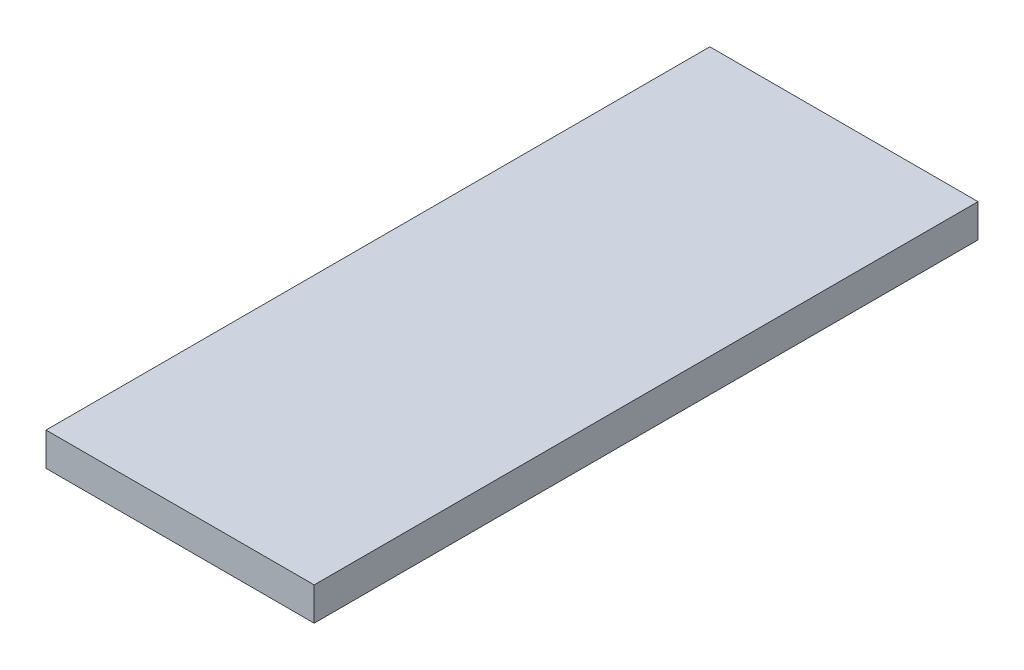
ISO-10303-21;
HEADER;
FILE_DESCRIPTION(('STEP AP214'),'2;1');
FILE_NAME('part.step','',(''),(''),'','','');
FILE_SCHEMA(('AUTOMOTIVE_DESIGN { 1 0 10303 214 1 1 1 1 }'));
ENDSEC;
DATA;
#1=APPLICATION_CONTEXT('core data for automotive mechanical design processes');
#2=APPLICATION_PROTOCOL_DEFINITION('international standard','automotive_design',2000,#1);
#3=PRODUCT_CONTEXT('',#1,'mechanical');
#4=PRODUCT('Part','Part','',(#3));
#5=PRODUCT_RELATED_PRODUCT_CATEGORY('part','',(#4));
#6=PRODUCT_DEFINITION_FORMATION('','',#4);
#7=PRODUCT_DEFINITION_CONTEXT('part definition',#1,'design');
#8=PRODUCT_DEFINITION('design','',#6,#7);
#9=PRODUCT_DEFINITION_SHAPE('','',#8);
#10=(LENGTH_UNIT() NAMED_UNIT(*) SI_UNIT(.MILLI.,.METRE.));
#11=(NAMED_UNIT(*) PLANE_ANGLE_UNIT() SI_UNIT($,.RADIAN.));
#12=(NAMED_UNIT(*) SI_UNIT($,.STERADIAN.) SOLID_ANGLE_UNIT());
#13=UNCERTAINTY_MEASURE_WITH_UNIT(LENGTH_MEASURE(1.E-05),#10,'distance_accuracy_value','');
#14=(GEOMETRIC_REPRESENTATION_CONTEXT(3) GLOBAL_UNCERTAINTY_ASSIGNED_CONTEXT((#13)) GLOBAL_UNIT_ASSIGNED_CONTEXT((#10,
#11,#12)) REPRESENTATION_CONTEXT('',''));
#15=CARTESIAN_POINT('',(0.,0.,0.));
#16=DIRECTION('',(0.,0.,1.));
#17=DIRECTION('',(1.,0.,0.));
#18=AXIS2_PLACEMENT_3D('',#15,#16,#17);
#19=CARTESIAN_POINT('',(6.4135,1.5875,15.875));
#20=DIRECTION('',(-1.,0.,0.));
#21=DIRECTION('',(0.,0.,1.));
#22=AXIS2_PLACEMENT_3D('',#19,#20,#21);
#23=PLANE('',#22);
#24=DIRECTION('',(0.,0.,-1.));
#25=VECTOR('',#24,1.);
#26=CARTESIAN_POINT('',(6.4135,0.,15.875));
#27=LINE('',#26,#25);
#28=CARTESIAN_POINT('',(6.4135,0.,15.875));
#29=VERTEX_POINT('',#28);
#30=CARTESIAN_POINT('',(6.4135,0.,-15.875));
#31=VERTEX_POINT('',#30);
#32=EDGE_CURVE('E99',#29,#31,#27,.T.);
#33=ORIENTED_EDGE('',*,*,#32,.T.);
#34=DIRECTION('',(0.,-1.,0.));
#35=VECTOR('',#34,1.);
#36=CARTESIAN_POINT('',(6.4135,1.5875,-15.875));
#37=LINE('',#36,#35);
#38=CARTESIAN_POINT('',(6.4135,1.5875,-15.875));
#39=VERTEX_POINT('',#38);
#40=EDGE_CURVE('E11',#39,#31,#37,.T.);
#41=ORIENTED_EDGE('',*,*,#40,.F.);
#42=DIRECTION('',(0.,0.,-1.));
#43=VECTOR('',#42,1.);
#44=CARTESIAN_POINT('',(6.4135,1.5875,15.875));
#45=LINE('',#44,#43);
#46=CARTESIAN_POINT('',(6.4135,1.5875,15.875));
#47=VERTEX_POINT('',#46);
#48=EDGE_CURVE('E87',#47,#39,#45,.T.);
#49=ORIENTED_EDGE('',*,*,#48,.F.);
#50=DIRECTION('',(0.,-1.,0.));
#51=VECTOR('',#50,1.);
#52=CARTESIAN_POINT('',(6.4135,1.5875,15.875));
#53=LINE('',#52,#51);
#54=EDGE_CURVE('E95',#47,#29,#53,.T.);
#55=ORIENTED_EDGE('',*,*,#54,.T.);
#56=EDGE_LOOP('',(#33,#41,#49,#55));
#57=FACE_BOUND('',#56,.T.);
#58=ADVANCED_FACE('F36',(#57),#23,.F.);
#59=CARTESIAN_POINT('',(-6.4135,1.5875,-15.875));
#60=DIRECTION('',(0.,0.,1.));
#61=DIRECTION('',(1.,0.,0.));
#62=AXIS2_PLACEMENT_3D('',#59,#60,#61);
#63=PLANE('',#62);
#64=DIRECTION('',(-1.,0.,0.));
#65=VECTOR('',#64,1.);
#66=CARTESIAN_POINT('',(-6.4135,0.,-15.875));
#67=LINE('',#66,#65);
#68=CARTESIAN_POINT('',(-6.4135,0.,-15.875));
#69=VERTEX_POINT('',#68);
#70=EDGE_CURVE('E91',#31,#69,#67,.T.);
#71=ORIENTED_EDGE('',*,*,#70,.T.);
#72=DIRECTION('',(0.,-1.,0.));
#73=VECTOR('',#72,1.);
#74=CARTESIAN_POINT('',(-6.4135,1.5875,-15.875));
#75=LINE('',#74,#73);
#76=CARTESIAN_POINT('',(-6.4135,1.5875,-15.875));
#77=VERTEX_POINT('',#76);
#78=EDGE_CURVE('E44',#77,#69,#75,.T.);
#79=ORIENTED_EDGE('',*,*,#78,.F.);
#80=DIRECTION('',(-1.,0.,0.));
#81=VECTOR('',#80,1.);
#82=CARTESIAN_POINT('',(-6.4135,1.5875,-15.875));
#83=LINE('',#82,#81);
#84=EDGE_CURVE('E82',#39,#77,#83,.T.);
#85=ORIENTED_EDGE('',*,*,#84,.F.);
#86=ORIENTED_EDGE('',*,*,#40,.T.);
#87=EDGE_LOOP('',(#71,#79,#85,#86));
#88=FACE_BOUND('',#87,.T.);
#89=ADVANCED_FACE('F90',(#88),#63,.F.);
#90=CARTESIAN_POINT('',(-6.4135,1.5875,15.875));
#91=DIRECTION('',(1.,0.,0.));
#92=DIRECTION('',(0.,0.,-1.));
#93=AXIS2_PLACEMENT_3D('',#90,#91,#92);
#94=PLANE('',#93);
#95=DIRECTION('',(0.,0.,1.));
#96=VECTOR('',#95,1.);
#97=CARTESIAN_POINT('',(-6.4135,0.,15.875));
#98=LINE('',#97,#96);
#99=CARTESIAN_POINT('',(-6.4135,0.,15.875));
#100=VERTEX_POINT('',#99);
#101=EDGE_CURVE('E69',#69,#100,#98,.T.);
#102=ORIENTED_EDGE('',*,*,#101,.T.);
#103=DIRECTION('',(0.,-1.,0.));
#104=VECTOR('',#103,1.);
#105=CARTESIAN_POINT('',(-6.4135,1.5875,15.875));
#106=LINE('',#105,#104);
#107=CARTESIAN_POINT('',(-6.4135,1.5875,15.875));
#108=VERTEX_POINT('',#107);
#109=EDGE_CURVE('E92',#108,#100,#106,.T.);
#110=ORIENTED_EDGE('',*,*,#109,.F.);
#111=DIRECTION('',(0.,0.,1.));
#112=VECTOR('',#111,1.);
#113=CARTESIAN_POINT('',(-6.4135,1.5875,15.875));
#114=LINE('',#113,#112);
#115=EDGE_CURVE('E85',#77,#108,#114,.T.);
#116=ORIENTED_EDGE('',*,*,#115,.F.);
#117=ORIENTED_EDGE('',*,*,#78,.T.);
#118=EDGE_LOOP('',(#102,#110,#116,#117));
#119=FACE_BOUND('',#118,.T.);
#120=ADVANCED_FACE('F93',(#119),#94,.F.);
#121=CARTESIAN_POINT('',(-6.4135,1.5875,15.875));
#122=DIRECTION('',(0.,0.,-1.));
#123=DIRECTION('',(-1.,0.,0.));
#124=AXIS2_PLACEMENT_3D('',#121,#122,#123);
#125=PLANE('',#124);
#126=DIRECTION('',(1.,0.,0.));
#127=VECTOR('',#126,1.);
#128=CARTESIAN_POINT('',(-6.4135,0.,15.875));
#129=LINE('',#128,#127);
#130=EDGE_CURVE('E75',#100,#29,#129,.T.);
#131=ORIENTED_EDGE('',*,*,#130,.T.);
#132=ORIENTED_EDGE('',*,*,#54,.F.);
#133=DIRECTION('',(1.,0.,0.));
#134=VECTOR('',#133,1.);
#135=CARTESIAN_POINT('',(-6.4135,1.5875,15.875));
#136=LINE('',#135,#134);
#137=EDGE_CURVE('E52',#108,#47,#136,.T.);
#138=ORIENTED_EDGE('',*,*,#137,.F.);
#139=ORIENTED_EDGE('',*,*,#109,.T.);
#140=EDGE_LOOP('',(#131,#132,#138,#139));
#141=FACE_BOUND('',#140,.T.);
#142=ADVANCED_FACE('F106',(#141),#125,.F.);
#143=CARTESIAN_POINT('',(0.,1.5875,0.));
#144=DIRECTION('',(0.,-1.,0.));
#145=DIRECTION('',(0.,0.,-1.));
#146=AXIS2_PLACEMENT_3D('',#143,#144,#145);
#147=PLANE('',#146);
#148=ORIENTED_EDGE('',*,*,#48,.T.);
#149=ORIENTED_EDGE('',*,*,#84,.T.);
#150=ORIENTED_EDGE('',*,*,#115,.T.);
#151=ORIENTED_EDGE('',*,*,#137,.T.);
#152=EDGE_LOOP('',(#148,#149,#150,#151));
#153=FACE_BOUND('',#152,.T.);
#154=ADVANCED_FACE('F83',(#153),#147,.F.);
#155=CARTESIAN_POINT('',(0.,0.,0.));
#156=DIRECTION('',(0.,-1.,0.));
#157=DIRECTION('',(0.,0.,-1.));
#158=AXIS2_PLACEMENT_3D('',#155,#156,#157);
#159=PLANE('',#158);
#160=ORIENTED_EDGE('',*,*,#32,.F.);
#161=ORIENTED_EDGE('',*,*,#130,.F.);
#162=ORIENTED_EDGE('',*,*,#101,.F.);
#163=ORIENTED_EDGE('',*,*,#70,.F.);
#164=EDGE_LOOP('',(#160,#161,#162,#163));
#165=FACE_BOUND('',#164,.T.);
#166=ADVANCED_FACE('F109',(#165),#159,.T.);
#167=CLOSED_SHELL('',(#58,#89,#120,#142,#154,#166));
#168=MANIFOLD_SOLID_BREP('B2',#167);
#169=ADVANCED_BREP_SHAPE_REPRESENTATION('',(#18,#168),#14);
#170=SHAPE_DEFINITION_REPRESENTATION(#9,#169);
ENDSEC;
END-ISO-10303-21;
